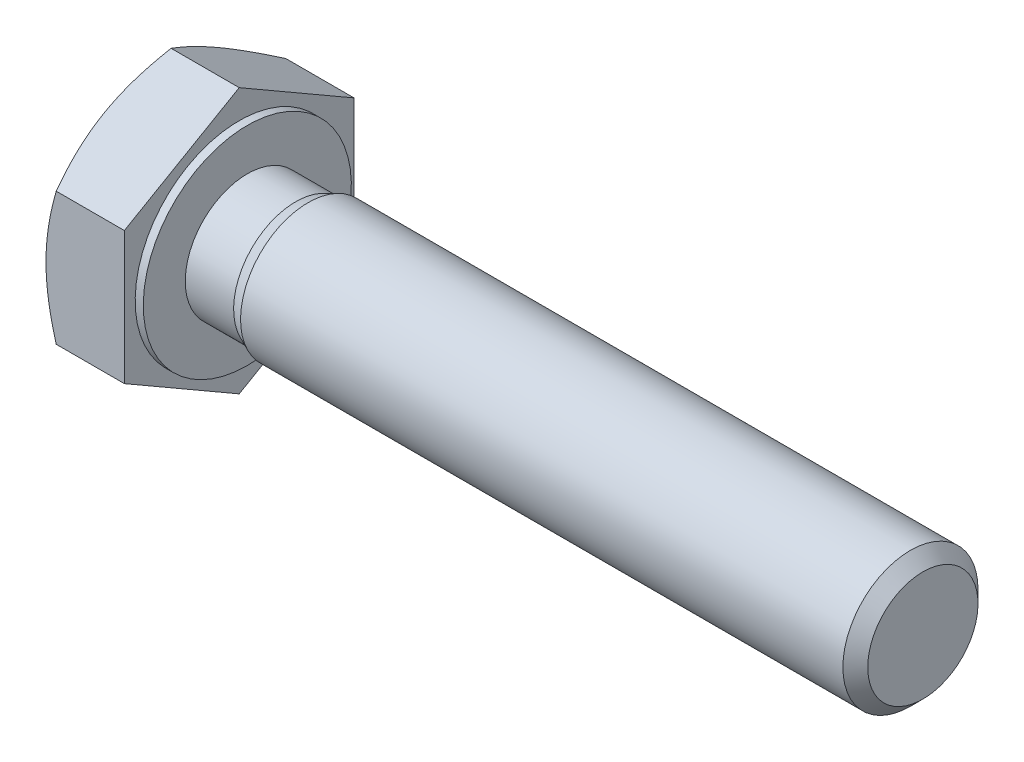
ISO-10303-21;
HEADER;
FILE_DESCRIPTION(('STEP AP214'),'2;1');
FILE_NAME('part.step','',(''),(''),'','','');
FILE_SCHEMA(('AUTOMOTIVE_DESIGN { 1 0 10303 214 1 1 1 1 }'));
ENDSEC;
DATA;
#1=APPLICATION_CONTEXT('core data for automotive mechanical design processes');
#2=APPLICATION_PROTOCOL_DEFINITION('international standard','automotive_design',2000,#1);
#3=PRODUCT_CONTEXT('',#1,'mechanical');
#4=PRODUCT('Part','Part','',(#3));
#5=PRODUCT_RELATED_PRODUCT_CATEGORY('part','',(#4));
#6=PRODUCT_DEFINITION_FORMATION('','',#4);
#7=PRODUCT_DEFINITION_CONTEXT('part definition',#1,'design');
#8=PRODUCT_DEFINITION('design','',#6,#7);
#9=PRODUCT_DEFINITION_SHAPE('','',#8);
#10=(LENGTH_UNIT() NAMED_UNIT(*) SI_UNIT(.MILLI.,.METRE.));
#11=(NAMED_UNIT(*) PLANE_ANGLE_UNIT() SI_UNIT($,.RADIAN.));
#12=(NAMED_UNIT(*) SI_UNIT($,.STERADIAN.) SOLID_ANGLE_UNIT());
#13=UNCERTAINTY_MEASURE_WITH_UNIT(LENGTH_MEASURE(1.E-05),#10,'distance_accuracy_value','');
#14=(GEOMETRIC_REPRESENTATION_CONTEXT(3) GLOBAL_UNCERTAINTY_ASSIGNED_CONTEXT((#13)) GLOBAL_UNIT_ASSIGNED_CONTEXT((#10,
#11,#12)) REPRESENTATION_CONTEXT('',''));
#15=CARTESIAN_POINT('',(0.,0.,0.));
#16=DIRECTION('',(0.,0.,1.));
#17=DIRECTION('',(1.,0.,0.));
#18=AXIS2_PLACEMENT_3D('',#15,#16,#17);
#19=CARTESIAN_POINT('',(4.03986250000001,0.,0.));
#20=DIRECTION('',(1.,0.,0.));
#21=DIRECTION('',(0.,1.,0.));
#22=AXIS2_PLACEMENT_3D('',#19,#20,#21);
#23=CONICAL_SURFACE('',#22,4.79702525,0.415442816396765);
#24=CARTESIAN_POINT('',(4.5,0.,0.));
#25=DIRECTION('',(1.,0.,0.));
#26=DIRECTION('',(0.,1.,0.));
#27=AXIS2_PLACEMENT_3D('',#24,#25,#26);
#28=CIRCLE('',#27,5.);
#29=CARTESIAN_POINT('',(4.5,-5.,0.));
#30=VERTEX_POINT('',#29);
#31=EDGE_CURVE('E188',#30,#30,#28,.T.);
#32=ORIENTED_EDGE('',*,*,#31,.F.);
#33=DIRECTION('',(-0.914937691667368,0.403595119354023,0.));
#34=VECTOR('',#33,1.);
#35=CARTESIAN_POINT('',(4.03986250000001,-4.79702525,0.));
#36=LINE('',#35,#34);
#37=CARTESIAN_POINT('',(3.579725,-4.5940505,0.));
#38=VERTEX_POINT('',#37);
#39=EDGE_CURVE('E11',#30,#38,#36,.T.);
#40=ORIENTED_EDGE('',*,*,#39,.T.);
#41=CARTESIAN_POINT('',(3.579725,0.,0.));
#42=DIRECTION('',(1.,0.,0.));
#43=DIRECTION('',(0.,1.,0.));
#44=AXIS2_PLACEMENT_3D('',#41,#42,#43);
#45=CIRCLE('',#44,4.5940505);
#46=EDGE_CURVE('E233',#38,#38,#45,.T.);
#47=ORIENTED_EDGE('',*,*,#46,.T.);
#48=ORIENTED_EDGE('',*,*,#39,.F.);
#49=EDGE_LOOP('',(#32,#40,#47,#48));
#50=FACE_BOUND('',#49,.T.);
#51=ADVANCED_FACE('F17',(#50),#23,.T.);
#52=CARTESIAN_POINT('',(1.7898625,0.,0.));
#53=DIRECTION('',(1.,0.,0.));
#54=DIRECTION('',(0.,1.,0.));
#55=AXIS2_PLACEMENT_3D('',#52,#53,#54);
#56=CYLINDRICAL_SURFACE('',#55,4.5940505);
#57=ORIENTED_EDGE('',*,*,#46,.F.);
#58=DIRECTION('',(-1.,0.,0.));
#59=VECTOR('',#58,1.);
#60=CARTESIAN_POINT('',(1.7898625,-4.5940505,0.));
#61=LINE('',#60,#59);
#62=CARTESIAN_POINT('',(0.,-4.5940505,0.));
#63=VERTEX_POINT('',#62);
#64=EDGE_CURVE('E28',#38,#63,#61,.T.);
#65=ORIENTED_EDGE('',*,*,#64,.T.);
#66=CARTESIAN_POINT('',(0.,0.,0.));
#67=DIRECTION('',(1.,0.,0.));
#68=DIRECTION('',(0.,1.,0.));
#69=AXIS2_PLACEMENT_3D('',#66,#67,#68);
#70=CIRCLE('',#69,4.5940505);
#71=EDGE_CURVE('E236',#63,#63,#70,.T.);
#72=ORIENTED_EDGE('',*,*,#71,.T.);
#73=ORIENTED_EDGE('',*,*,#64,.F.);
#74=EDGE_LOOP('',(#57,#65,#72,#73));
#75=FACE_BOUND('',#74,.T.);
#76=ADVANCED_FACE('F445',(#75),#56,.T.);
#77=CARTESIAN_POINT('',(0.,6.14702525,0.));
#78=DIRECTION('',(1.,0.,0.));
#79=DIRECTION('',(0.,1.,0.));
#80=AXIS2_PLACEMENT_3D('',#77,#78,#79);
#81=PLANE('',#80);
#82=ORIENTED_EDGE('',*,*,#71,.F.);
#83=EDGE_LOOP('',(#82));
#84=FACE_BOUND('',#83,.T.);
#85=CARTESIAN_POINT('',(0.,0.,0.));
#86=DIRECTION('',(1.,0.,0.));
#87=DIRECTION('',(0.,1.,0.));
#88=AXIS2_PLACEMENT_3D('',#85,#86,#87);
#89=CIRCLE('',#88,7.7);
#90=CARTESIAN_POINT('',(0.,-7.7,0.));
#91=VERTEX_POINT('',#90);
#92=EDGE_CURVE('E309',#91,#91,#89,.T.);
#93=ORIENTED_EDGE('',*,*,#92,.T.);
#94=EDGE_LOOP('',(#93));
#95=FACE_BOUND('',#94,.T.);
#96=ADVANCED_FACE('F450',(#84,#95),#81,.T.);
#97=CARTESIAN_POINT('',(-0.30005,0.,0.));
#98=DIRECTION('',(1.,0.,0.));
#99=DIRECTION('',(0.,1.,0.));
#100=AXIS2_PLACEMENT_3D('',#97,#98,#99);
#101=CYLINDRICAL_SURFACE('',#100,7.7);
#102=ORIENTED_EDGE('',*,*,#92,.F.);
#103=DIRECTION('',(-1.,0.,0.));
#104=VECTOR('',#103,1.);
#105=CARTESIAN_POINT('',(-0.30005,-7.7,0.));
#106=LINE('',#105,#104);
#107=CARTESIAN_POINT('',(-0.600099999999993,-7.7,0.));
#108=VERTEX_POINT('',#107);
#109=EDGE_CURVE('E316',#91,#108,#106,.T.);
#110=ORIENTED_EDGE('',*,*,#109,.T.);
#111=CARTESIAN_POINT('',(-0.600099999999992,0.,0.));
#112=DIRECTION('',(1.,0.,0.));
#113=DIRECTION('',(0.,1.,0.));
#114=AXIS2_PLACEMENT_3D('',#111,#112,#113);
#115=CIRCLE('',#114,7.7);
#116=EDGE_CURVE('E161',#108,#108,#115,.T.);
#117=ORIENTED_EDGE('',*,*,#116,.T.);
#118=ORIENTED_EDGE('',*,*,#109,.F.);
#119=EDGE_LOOP('',(#102,#110,#117,#118));
#120=FACE_BOUND('',#119,.T.);
#121=ADVANCED_FACE('F468',(#120),#101,.T.);
#122=CARTESIAN_POINT('',(-6.4001,0.,0.));
#123=DIRECTION('',(1.,0.,0.));
#124=DIRECTION('',(0.,1.,0.));
#125=AXIS2_PLACEMENT_3D('',#122,#123,#124);
#126=PLANE('',#125);
#127=CARTESIAN_POINT('',(-6.4001,0.,0.));
#128=DIRECTION('',(-1.,0.,0.));
#129=DIRECTION('',(0.,1.,0.));
#130=AXIS2_PLACEMENT_3D('',#127,#128,#129);
#131=CIRCLE('',#130,8.5);
#132=CARTESIAN_POINT('',(-6.4001,0.,8.5));
#133=VERTEX_POINT('',#132);
#134=CARTESIAN_POINT('',(-6.4001,7.36121593216772,4.25));
#135=VERTEX_POINT('',#134);
#136=EDGE_CURVE('E242',#133,#135,#131,.T.);
#137=ORIENTED_EDGE('',*,*,#136,.T.);
#138=CARTESIAN_POINT('',(-6.4001,0.,0.));
#139=DIRECTION('',(-1.,0.,0.));
#140=DIRECTION('',(0.,1.,0.));
#141=AXIS2_PLACEMENT_3D('',#138,#139,#140);
#142=CIRCLE('',#141,8.5);
#143=CARTESIAN_POINT('',(-6.4001,7.36121593216772,-4.25));
#144=VERTEX_POINT('',#143);
#145=EDGE_CURVE('E243',#135,#144,#142,.T.);
#146=ORIENTED_EDGE('',*,*,#145,.T.);
#147=CARTESIAN_POINT('',(-6.4001,0.,0.));
#148=DIRECTION('',(-1.,0.,0.));
#149=DIRECTION('',(0.,1.,0.));
#150=AXIS2_PLACEMENT_3D('',#147,#148,#149);
#151=CIRCLE('',#150,8.5);
#152=CARTESIAN_POINT('',(-6.4001,0.,-8.5));
#153=VERTEX_POINT('',#152);
#154=EDGE_CURVE('E263',#144,#153,#151,.T.);
#155=ORIENTED_EDGE('',*,*,#154,.T.);
#156=CARTESIAN_POINT('',(-6.4001,0.,0.));
#157=DIRECTION('',(-1.,0.,0.));
#158=DIRECTION('',(0.,1.,0.));
#159=AXIS2_PLACEMENT_3D('',#156,#157,#158);
#160=CIRCLE('',#159,8.5);
#161=CARTESIAN_POINT('',(-6.4001,-7.36121593216772,-4.25));
#162=VERTEX_POINT('',#161);
#163=EDGE_CURVE('E184',#153,#162,#160,.T.);
#164=ORIENTED_EDGE('',*,*,#163,.T.);
#165=CARTESIAN_POINT('',(-6.4001,0.,0.));
#166=DIRECTION('',(-1.,0.,0.));
#167=DIRECTION('',(0.,1.,0.));
#168=AXIS2_PLACEMENT_3D('',#165,#166,#167);
#169=CIRCLE('',#168,8.5);
#170=CARTESIAN_POINT('',(-6.4001,-7.36121593216773,4.25));
#171=VERTEX_POINT('',#170);
#172=EDGE_CURVE('E264',#162,#171,#169,.T.);
#173=ORIENTED_EDGE('',*,*,#172,.T.);
#174=CARTESIAN_POINT('',(-6.4001,0.,0.));
#175=DIRECTION('',(-1.,0.,0.));
#176=DIRECTION('',(0.,1.,0.));
#177=AXIS2_PLACEMENT_3D('',#174,#175,#176);
#178=CIRCLE('',#177,8.5);
#179=EDGE_CURVE('E194',#171,#133,#178,.T.);
#180=ORIENTED_EDGE('',*,*,#179,.T.);
#181=EDGE_LOOP('',(#137,#146,#155,#164,#173,#180));
#182=FACE_BOUND('',#181,.T.);
#183=ADVANCED_FACE('F372',(#182),#126,.F.);
#184=CARTESIAN_POINT('',(-0.600099999999993,-9.81495457622363,0.));
#185=DIRECTION('',(0.,-0.866025403784439,-0.5));
#186=DIRECTION('',(0.,0.5,-0.866025403784439));
#187=AXIS2_PLACEMENT_3D('',#184,#185,#186);
#188=PLANE('',#187);
#189=CARTESIAN_POINT('',(-6.4001,-7.36121593216772,-4.25));
#190=CARTESIAN_POINT('',(-6.40010000000002,-6.22243186433546,-6.22243186433545));
#191=CARTESIAN_POINT('',(-5.64091062144518,-4.90747728811183,-8.5));
#192=(BOUNDED_CURVE() B_SPLINE_CURVE(2,(#189,#190,#191),.UNSPECIFIED.,.F.,
.F.) B_SPLINE_CURVE_WITH_KNOTS((3,3),(0.497853260958953,0.995706521917906),
.UNSPECIFIED.) CURVE() GEOMETRIC_REPRESENTATION_ITEM() RATIONAL_B_SPLINE_CURVE((1.,
1.03795484930205,1.)) REPRESENTATION_ITEM(''));
#193=CARTESIAN_POINT('',(-5.64091062144518,-4.90747728811183,-8.5));
#194=VERTEX_POINT('',#193);
#195=EDGE_CURVE('E168',#162,#194,#192,.T.);
#196=ORIENTED_EDGE('',*,*,#195,.T.);
#197=DIRECTION('',(-1.,0.,0.));
#198=VECTOR('',#197,1.);
#199=CARTESIAN_POINT('',(-0.600099999999993,-4.90747728811181,-8.5));
#200=LINE('',#199,#198);
#201=CARTESIAN_POINT('',(-0.600099999999993,-4.90747728811181,-8.5));
#202=VERTEX_POINT('',#201);
#203=EDGE_CURVE('E164',#202,#194,#200,.T.);
#204=ORIENTED_EDGE('',*,*,#203,.F.);
#205=DIRECTION('',(0.,0.5,-0.866025403784439));
#206=VECTOR('',#205,1.);
#207=CARTESIAN_POINT('',(-0.600099999999993,-9.81495457622363,0.));
#208=LINE('',#207,#206);
#209=CARTESIAN_POINT('',(-0.600099999999993,-9.81495457622363,0.));
#210=VERTEX_POINT('',#209);
#211=EDGE_CURVE('E148',#210,#202,#208,.T.);
#212=ORIENTED_EDGE('',*,*,#211,.F.);
#213=DIRECTION('',(-1.,0.,0.));
#214=VECTOR('',#213,1.);
#215=CARTESIAN_POINT('',(-0.600099999999993,-9.81495457622363,0.));
#216=LINE('',#215,#214);
#217=CARTESIAN_POINT('',(-5.64091062144518,-9.81495457622362,0.));
#218=VERTEX_POINT('',#217);
#219=EDGE_CURVE('E297',#210,#218,#216,.T.);
#220=ORIENTED_EDGE('',*,*,#219,.T.);
#221=CARTESIAN_POINT('',(-5.64091062144518,-9.81495457622362,0.));
#222=CARTESIAN_POINT('',(-6.40010000000002,-8.49999999999999,-2.27756813566456));
#223=CARTESIAN_POINT('',(-6.4001,-7.36121593216772,-4.25));
#224=(BOUNDED_CURVE() B_SPLINE_CURVE(2,(#221,#222,#223),.UNSPECIFIED.,.F.,
.F.) B_SPLINE_CURVE_WITH_KNOTS((3,3),(0.,0.497853260958953),
.UNSPECIFIED.) CURVE() GEOMETRIC_REPRESENTATION_ITEM() RATIONAL_B_SPLINE_CURVE((1.,
1.03795484930206,1.)) REPRESENTATION_ITEM(''));
#225=EDGE_CURVE('E220',#218,#162,#224,.T.);
#226=ORIENTED_EDGE('',*,*,#225,.T.);
#227=EDGE_LOOP('',(#196,#204,#212,#220,#226));
#228=FACE_BOUND('',#227,.T.);
#229=ADVANCED_FACE('F165',(#228),#188,.T.);
#230=CARTESIAN_POINT('',(-0.600099999999993,-4.90747728811182,8.5));
#231=DIRECTION('',(0.,-0.866025403784439,0.5));
#232=DIRECTION('',(-1.,0.,0.));
#233=AXIS2_PLACEMENT_3D('',#230,#231,#232);
#234=PLANE('',#233);
#235=CARTESIAN_POINT('',(-6.4001,-7.36121593216773,4.25));
#236=CARTESIAN_POINT('',(-6.40010000000002,-8.5,2.27756813566455));
#237=CARTESIAN_POINT('',(-5.64091062144518,-9.81495457622362,0.));
#238=(BOUNDED_CURVE() B_SPLINE_CURVE(2,(#235,#236,#237),.UNSPECIFIED.,.F.,
.F.) B_SPLINE_CURVE_WITH_KNOTS((3,3),(0.497853260958953,0.995706521917906),
.UNSPECIFIED.) CURVE() GEOMETRIC_REPRESENTATION_ITEM() RATIONAL_B_SPLINE_CURVE((1.,
1.03795484930203,1.)) REPRESENTATION_ITEM(''));
#239=EDGE_CURVE('E225',#171,#218,#238,.T.);
#240=ORIENTED_EDGE('',*,*,#239,.T.);
#241=ORIENTED_EDGE('',*,*,#219,.F.);
#242=DIRECTION('',(0.,-0.5,-0.866025403784439));
#243=VECTOR('',#242,1.);
#244=CARTESIAN_POINT('',(-0.600099999999993,-4.90747728811182,8.5));
#245=LINE('',#244,#243);
#246=CARTESIAN_POINT('',(-0.600099999999993,-4.90747728811182,8.5));
#247=VERTEX_POINT('',#246);
#248=EDGE_CURVE('E158',#247,#210,#245,.T.);
#249=ORIENTED_EDGE('',*,*,#248,.F.);
#250=DIRECTION('',(-1.,0.,0.));
#251=VECTOR('',#250,1.);
#252=CARTESIAN_POINT('',(-0.600099999999993,-4.90747728811182,8.5));
#253=LINE('',#252,#251);
#254=CARTESIAN_POINT('',(-5.64091062144518,-4.90747728811179,8.5));
#255=VERTEX_POINT('',#254);
#256=EDGE_CURVE('E212',#247,#255,#253,.T.);
#257=ORIENTED_EDGE('',*,*,#256,.T.);
#258=CARTESIAN_POINT('',(-5.64091062144518,-4.90747728811184,8.5));
#259=CARTESIAN_POINT('',(-6.40010000000002,-6.22243186433548,6.22243186433543));
#260=CARTESIAN_POINT('',(-6.4001,-7.36121593216773,4.25));
#261=(BOUNDED_CURVE() B_SPLINE_CURVE(2,(#258,#259,#260),.UNSPECIFIED.,.F.,
.F.) B_SPLINE_CURVE_WITH_KNOTS((3,3),(0.,0.497853260958953),
.UNSPECIFIED.) CURVE() GEOMETRIC_REPRESENTATION_ITEM() RATIONAL_B_SPLINE_CURVE((1.,
1.03795484930204,1.)) REPRESENTATION_ITEM(''));
#262=EDGE_CURVE('E199',#255,#171,#261,.T.);
#263=ORIENTED_EDGE('',*,*,#262,.T.);
#264=EDGE_LOOP('',(#240,#241,#249,#257,#263));
#265=FACE_BOUND('',#264,.T.);
#266=ADVANCED_FACE('F364',(#265),#234,.T.);
#267=CARTESIAN_POINT('',(-0.6001,4.90747728811181,8.5));
#268=DIRECTION('',(0.,0.,1.));
#269=DIRECTION('',(0.,-1.,0.));
#270=AXIS2_PLACEMENT_3D('',#267,#268,#269);
#271=PLANE('',#270);
#272=CARTESIAN_POINT('',(-6.4001,0.,8.5));
#273=CARTESIAN_POINT('',(-6.40010000000002,-2.27756813566454,8.49999999999999));
#274=CARTESIAN_POINT('',(-5.64091062144518,-4.90747728811179,8.5));
#275=(BOUNDED_CURVE() B_SPLINE_CURVE(2,(#272,#273,#274),.UNSPECIFIED.,.F.,
.F.) B_SPLINE_CURVE_WITH_KNOTS((3,3),(0.497853260958953,0.995706521917907),
.UNSPECIFIED.) CURVE() GEOMETRIC_REPRESENTATION_ITEM() RATIONAL_B_SPLINE_CURVE((1.,
1.03795484930206,1.)) REPRESENTATION_ITEM(''));
#276=EDGE_CURVE('E198',#133,#255,#275,.T.);
#277=ORIENTED_EDGE('',*,*,#276,.T.);
#278=ORIENTED_EDGE('',*,*,#256,.F.);
#279=DIRECTION('',(0.,-1.,0.));
#280=VECTOR('',#279,1.);
#281=CARTESIAN_POINT('',(-0.6001,4.90747728811181,8.5));
#282=LINE('',#281,#280);
#283=CARTESIAN_POINT('',(-0.6001,4.90747728811181,8.5));
#284=VERTEX_POINT('',#283);
#285=EDGE_CURVE('E232',#284,#247,#282,.T.);
#286=ORIENTED_EDGE('',*,*,#285,.F.);
#287=DIRECTION('',(-1.,0.,0.));
#288=VECTOR('',#287,1.);
#289=CARTESIAN_POINT('',(-0.6001,4.90747728811181,8.5));
#290=LINE('',#289,#288);
#291=CARTESIAN_POINT('',(-5.64091062144518,4.90747728811178,8.5));
#292=VERTEX_POINT('',#291);
#293=EDGE_CURVE('E189',#284,#292,#290,.T.);
#294=ORIENTED_EDGE('',*,*,#293,.T.);
#295=CARTESIAN_POINT('',(-5.64091062144518,4.90747728811178,8.5));
#296=CARTESIAN_POINT('',(-6.40010000000002,2.27756813566453,8.5));
#297=CARTESIAN_POINT('',(-6.4001,0.,8.5));
#298=(BOUNDED_CURVE() B_SPLINE_CURVE(2,(#295,#296,#297),.UNSPECIFIED.,.F.,
.F.) B_SPLINE_CURVE_WITH_KNOTS((3,3),(0.,0.497853260958953),
.UNSPECIFIED.) CURVE() GEOMETRIC_REPRESENTATION_ITEM() RATIONAL_B_SPLINE_CURVE((1.,
1.03795484930206,1.)) REPRESENTATION_ITEM(''));
#299=EDGE_CURVE('E205',#292,#133,#298,.T.);
#300=ORIENTED_EDGE('',*,*,#299,.T.);
#301=EDGE_LOOP('',(#277,#278,#286,#294,#300));
#302=FACE_BOUND('',#301,.T.);
#303=ADVANCED_FACE('F359',(#302),#271,.T.);
#304=CARTESIAN_POINT('',(-0.6001,0.,0.));
#305=DIRECTION('',(1.,0.,0.));
#306=DIRECTION('',(0.,1.,0.));
#307=AXIS2_PLACEMENT_3D('',#304,#305,#306);
#308=PLANE('',#307);
#309=ORIENTED_EDGE('',*,*,#116,.F.);
#310=EDGE_LOOP('',(#309));
#311=FACE_BOUND('',#310,.T.);
#312=DIRECTION('',(0.,-0.5,0.866025403784438));
#313=VECTOR('',#312,1.);
#314=CARTESIAN_POINT('',(-0.6001,9.81495457622363,0.));
#315=LINE('',#314,#313);
#316=CARTESIAN_POINT('',(-0.6001,9.81495457622363,0.));
#317=VERTEX_POINT('',#316);
#318=EDGE_CURVE('E193',#317,#284,#315,.T.);
#319=ORIENTED_EDGE('',*,*,#318,.T.);
#320=ORIENTED_EDGE('',*,*,#285,.T.);
#321=ORIENTED_EDGE('',*,*,#248,.T.);
#322=ORIENTED_EDGE('',*,*,#211,.T.);
#323=DIRECTION('',(0.,1.,0.));
#324=VECTOR('',#323,1.);
#325=CARTESIAN_POINT('',(-0.600099999999993,-4.90747728811181,-8.5));
#326=LINE('',#325,#324);
#327=CARTESIAN_POINT('',(-0.6001,4.90747728811182,-8.5));
#328=VERTEX_POINT('',#327);
#329=EDGE_CURVE('E154',#202,#328,#326,.T.);
#330=ORIENTED_EDGE('',*,*,#329,.T.);
#331=DIRECTION('',(0.,0.5,0.866025403784439));
#332=VECTOR('',#331,1.);
#333=CARTESIAN_POINT('',(-0.6001,4.90747728811182,-8.5));
#334=LINE('',#333,#332);
#335=EDGE_CURVE('E21',#328,#317,#334,.T.);
#336=ORIENTED_EDGE('',*,*,#335,.T.);
#337=EDGE_LOOP('',(#319,#320,#321,#322,#330,#336));
#338=FACE_BOUND('',#337,.T.);
#339=ADVANCED_FACE('F151',(#311,#338),#308,.T.);
#340=CARTESIAN_POINT('',(-0.6001,9.81495457622363,0.));
#341=DIRECTION('',(0.,0.866025403784438,0.5));
#342=DIRECTION('',(1.,0.,0.));
#343=AXIS2_PLACEMENT_3D('',#340,#341,#342);
#344=PLANE('',#343);
#345=CARTESIAN_POINT('',(-5.64091062144518,9.81495457622362,0.));
#346=CARTESIAN_POINT('',(-6.40010000000001,8.5,2.27756813566456));
#347=CARTESIAN_POINT('',(-6.4001,7.36121593216772,4.25));
#348=(BOUNDED_CURVE() B_SPLINE_CURVE(2,(#345,#346,#347),.UNSPECIFIED.,.F.,
.F.) B_SPLINE_CURVE_WITH_KNOTS((3,3),(0.,0.497853260958953),
.UNSPECIFIED.) CURVE() GEOMETRIC_REPRESENTATION_ITEM() RATIONAL_B_SPLINE_CURVE((1.,
1.03795484930205,1.)) REPRESENTATION_ITEM(''));
#349=CARTESIAN_POINT('',(-5.64091062144518,9.81495457622362,0.));
#350=VERTEX_POINT('',#349);
#351=EDGE_CURVE('E226',#350,#135,#348,.T.);
#352=ORIENTED_EDGE('',*,*,#351,.T.);
#353=CARTESIAN_POINT('',(-6.4001,7.36121593216772,4.25));
#354=CARTESIAN_POINT('',(-6.40010000000002,6.22243186433546,6.22243186433544));
#355=CARTESIAN_POINT('',(-5.64091062144518,4.90747728811182,8.5));
#356=(BOUNDED_CURVE() B_SPLINE_CURVE(2,(#353,#354,#355),.UNSPECIFIED.,.F.,
.F.) B_SPLINE_CURVE_WITH_KNOTS((3,3),(0.497853260958953,0.995706521917907),
.UNSPECIFIED.) CURVE() GEOMETRIC_REPRESENTATION_ITEM() RATIONAL_B_SPLINE_CURVE((1.,
1.03795484930206,1.)) REPRESENTATION_ITEM(''));
#357=EDGE_CURVE('E298',#135,#292,#356,.T.);
#358=ORIENTED_EDGE('',*,*,#357,.T.);
#359=ORIENTED_EDGE('',*,*,#293,.F.);
#360=ORIENTED_EDGE('',*,*,#318,.F.);
#361=DIRECTION('',(-1.,0.,0.));
#362=VECTOR('',#361,1.);
#363=CARTESIAN_POINT('',(-0.6001,9.81495457622363,0.));
#364=LINE('',#363,#362);
#365=EDGE_CURVE('E173',#317,#350,#364,.T.);
#366=ORIENTED_EDGE('',*,*,#365,.T.);
#367=EDGE_LOOP('',(#352,#358,#359,#360,#366));
#368=FACE_BOUND('',#367,.T.);
#369=ADVANCED_FACE('F462',(#368),#344,.T.);
#370=CARTESIAN_POINT('',(-0.6001,4.90747728811182,-8.5));
#371=DIRECTION('',(0.,0.866025403784439,-0.5));
#372=DIRECTION('',(-1.,0.,0.));
#373=AXIS2_PLACEMENT_3D('',#370,#371,#372);
#374=PLANE('',#373);
#375=CARTESIAN_POINT('',(-5.64091062144518,4.90747728811183,-8.5));
#376=CARTESIAN_POINT('',(-6.40010000000002,6.22243186433545,-6.22243186433545));
#377=CARTESIAN_POINT('',(-6.4001,7.36121593216772,-4.25));
#378=(BOUNDED_CURVE() B_SPLINE_CURVE(2,(#375,#376,#377),.UNSPECIFIED.,.F.,
.F.) B_SPLINE_CURVE_WITH_KNOTS((3,3),(0.,0.497853260958954),
.UNSPECIFIED.) CURVE() GEOMETRIC_REPRESENTATION_ITEM() RATIONAL_B_SPLINE_CURVE((1.,
1.03795484930204,1.)) REPRESENTATION_ITEM(''));
#379=CARTESIAN_POINT('',(-5.64091062144518,4.90747728811179,-8.5));
#380=VERTEX_POINT('',#379);
#381=EDGE_CURVE('E265',#380,#144,#378,.T.);
#382=ORIENTED_EDGE('',*,*,#381,.T.);
#383=CARTESIAN_POINT('',(-6.4001,7.36121593216772,-4.25));
#384=CARTESIAN_POINT('',(-6.40010000000002,8.49999999999999,-2.27756813566454));
#385=CARTESIAN_POINT('',(-5.64091062144518,9.81495457622362,0.));
#386=(BOUNDED_CURVE() B_SPLINE_CURVE(2,(#383,#384,#385),.UNSPECIFIED.,.F.,
.F.) B_SPLINE_CURVE_WITH_KNOTS((3,3),(0.497853260958954,0.995706521917908),
.UNSPECIFIED.) CURVE() GEOMETRIC_REPRESENTATION_ITEM() RATIONAL_B_SPLINE_CURVE((1.,
1.03795484930204,1.)) REPRESENTATION_ITEM(''));
#387=EDGE_CURVE('E197',#144,#350,#386,.T.);
#388=ORIENTED_EDGE('',*,*,#387,.T.);
#389=ORIENTED_EDGE('',*,*,#365,.F.);
#390=ORIENTED_EDGE('',*,*,#335,.F.);
#391=DIRECTION('',(-1.,0.,0.));
#392=VECTOR('',#391,1.);
#393=CARTESIAN_POINT('',(-0.6001,4.90747728811182,-8.5));
#394=LINE('',#393,#392);
#395=EDGE_CURVE('E177',#328,#380,#394,.T.);
#396=ORIENTED_EDGE('',*,*,#395,.T.);
#397=EDGE_LOOP('',(#382,#388,#389,#390,#396));
#398=FACE_BOUND('',#397,.T.);
#399=ADVANCED_FACE('F457',(#398),#374,.T.);
#400=CARTESIAN_POINT('',(-0.600099999999993,-4.90747728811181,-8.5));
#401=DIRECTION('',(0.,0.,-1.));
#402=DIRECTION('',(-1.,0.,0.));
#403=AXIS2_PLACEMENT_3D('',#400,#401,#402);
#404=PLANE('',#403);
#405=CARTESIAN_POINT('',(-5.64091062144518,-4.90747728811178,-8.5));
#406=CARTESIAN_POINT('',(-6.40010000000001,-2.27756813566453,-8.5));
#407=CARTESIAN_POINT('',(-6.4001,0.,-8.5));
#408=(BOUNDED_CURVE() B_SPLINE_CURVE(2,(#405,#406,#407),.UNSPECIFIED.,.F.,
.F.) B_SPLINE_CURVE_WITH_KNOTS((3,3),(0.,0.497853260958953),
.UNSPECIFIED.) CURVE() GEOMETRIC_REPRESENTATION_ITEM() RATIONAL_B_SPLINE_CURVE((1.,
1.03795484930204,1.)) REPRESENTATION_ITEM(''));
#409=EDGE_CURVE('E254',#194,#153,#408,.T.);
#410=ORIENTED_EDGE('',*,*,#409,.T.);
#411=CARTESIAN_POINT('',(-6.4001,0.,-8.5));
#412=CARTESIAN_POINT('',(-6.40010000000001,2.27756813566454,-8.5));
#413=CARTESIAN_POINT('',(-5.64091062144518,4.90747728811179,-8.5));
#414=(BOUNDED_CURVE() B_SPLINE_CURVE(2,(#411,#412,#413),.UNSPECIFIED.,.F.,
.F.) B_SPLINE_CURVE_WITH_KNOTS((3,3),(0.497853260958953,0.995706521917907),
.UNSPECIFIED.) CURVE() GEOMETRIC_REPRESENTATION_ITEM() RATIONAL_B_SPLINE_CURVE((1.,
1.03795484930205,1.)) REPRESENTATION_ITEM(''));
#415=EDGE_CURVE('E255',#153,#380,#414,.T.);
#416=ORIENTED_EDGE('',*,*,#415,.T.);
#417=ORIENTED_EDGE('',*,*,#395,.F.);
#418=ORIENTED_EDGE('',*,*,#329,.F.);
#419=ORIENTED_EDGE('',*,*,#203,.T.);
#420=EDGE_LOOP('',(#410,#416,#417,#418,#419));
#421=FACE_BOUND('',#420,.T.);
#422=ADVANCED_FACE('F175',(#421),#404,.T.);
#423=CARTESIAN_POINT('',(-6.02050531072259,0.,0.));
#424=DIRECTION('',(1.,0.,0.));
#425=DIRECTION('',(0.,1.,0.));
#426=AXIS2_PLACEMENT_3D('',#423,#424,#425);
#427=CONICAL_SURFACE('',#426,9.15747728811181,1.0471975511966);
#428=ORIENTED_EDGE('',*,*,#409,.F.);
#429=ORIENTED_EDGE('',*,*,#195,.F.);
#430=ORIENTED_EDGE('',*,*,#163,.F.);
#431=EDGE_LOOP('',(#428,#429,#430));
#432=FACE_BOUND('',#431,.T.);
#433=ADVANCED_FACE('F400',(#432),#427,.T.);
#434=CARTESIAN_POINT('',(-6.02050531072259,0.,0.));
#435=DIRECTION('',(1.,0.,0.));
#436=DIRECTION('',(0.,1.,0.));
#437=AXIS2_PLACEMENT_3D('',#434,#435,#436);
#438=CONICAL_SURFACE('',#437,9.15747728811181,1.0471975511966);
#439=ORIENTED_EDGE('',*,*,#415,.F.);
#440=ORIENTED_EDGE('',*,*,#154,.F.);
#441=ORIENTED_EDGE('',*,*,#381,.F.);
#442=EDGE_LOOP('',(#439,#440,#441));
#443=FACE_BOUND('',#442,.T.);
#444=ADVANCED_FACE('F405',(#443),#438,.T.);
#445=CARTESIAN_POINT('',(-6.02050531072259,0.,0.));
#446=DIRECTION('',(1.,0.,0.));
#447=DIRECTION('',(0.,-1.,0.));
#448=AXIS2_PLACEMENT_3D('',#445,#446,#447);
#449=CONICAL_SURFACE('',#448,9.15747728811181,1.0471975511966);
#450=ORIENTED_EDGE('',*,*,#225,.F.);
#451=ORIENTED_EDGE('',*,*,#239,.F.);
#452=ORIENTED_EDGE('',*,*,#172,.F.);
#453=EDGE_LOOP('',(#450,#451,#452));
#454=FACE_BOUND('',#453,.T.);
#455=ADVANCED_FACE('F369',(#454),#449,.T.);
#456=CARTESIAN_POINT('',(-6.02050531072259,0.,0.));
#457=DIRECTION('',(1.,0.,0.));
#458=DIRECTION('',(0.,1.,0.));
#459=AXIS2_PLACEMENT_3D('',#456,#457,#458);
#460=CONICAL_SURFACE('',#459,9.15747728811181,1.0471975511966);
#461=ORIENTED_EDGE('',*,*,#387,.F.);
#462=ORIENTED_EDGE('',*,*,#145,.F.);
#463=ORIENTED_EDGE('',*,*,#351,.F.);
#464=EDGE_LOOP('',(#461,#462,#463));
#465=FACE_BOUND('',#464,.T.);
#466=ADVANCED_FACE('F419',(#465),#460,.T.);
#467=CARTESIAN_POINT('',(-6.02050531072259,0.,0.));
#468=DIRECTION('',(1.,0.,0.));
#469=DIRECTION('',(0.,1.,0.));
#470=AXIS2_PLACEMENT_3D('',#467,#468,#469);
#471=CONICAL_SURFACE('',#470,9.15747728811181,1.0471975511966);
#472=ORIENTED_EDGE('',*,*,#262,.F.);
#473=ORIENTED_EDGE('',*,*,#276,.F.);
#474=ORIENTED_EDGE('',*,*,#179,.F.);
#475=EDGE_LOOP('',(#472,#473,#474));
#476=FACE_BOUND('',#475,.T.);
#477=ADVANCED_FACE('F424',(#476),#471,.T.);
#478=CARTESIAN_POINT('',(-6.02050531072259,0.,0.));
#479=DIRECTION('',(1.,0.,0.));
#480=DIRECTION('',(0.,1.,0.));
#481=AXIS2_PLACEMENT_3D('',#478,#479,#480);
#482=CONICAL_SURFACE('',#481,9.15747728811181,1.0471975511966);
#483=ORIENTED_EDGE('',*,*,#357,.F.);
#484=ORIENTED_EDGE('',*,*,#136,.F.);
#485=ORIENTED_EDGE('',*,*,#299,.F.);
#486=EDGE_LOOP('',(#483,#484,#485));
#487=FACE_BOUND('',#486,.T.);
#488=ADVANCED_FACE('F386',(#487),#482,.T.);
#489=CARTESIAN_POINT('',(50.,2.5,0.));
#490=DIRECTION('',(1.,0.,0.));
#491=DIRECTION('',(0.,1.,0.));
#492=AXIS2_PLACEMENT_3D('',#489,#490,#491);
#493=PLANE('',#492);
#494=CARTESIAN_POINT('',(50.,0.,0.));
#495=DIRECTION('',(-1.,0.,0.));
#496=DIRECTION('',(0.,-1.,0.));
#497=AXIS2_PLACEMENT_3D('',#494,#495,#496);
#498=CIRCLE('',#497,4.079825);
#499=CARTESIAN_POINT('',(50.,4.079825,0.));
#500=VERTEX_POINT('',#499);
#501=EDGE_CURVE('E213',#500,#500,#498,.T.);
#502=ORIENTED_EDGE('',*,*,#501,.F.);
#503=EDGE_LOOP('',(#502));
#504=FACE_BOUND('',#503,.T.);
#505=ADVANCED_FACE('F19',(#504),#493,.T.);
#506=CARTESIAN_POINT('',(27.25,0.,0.));
#507=DIRECTION('',(1.,0.,0.));
#508=DIRECTION('',(0.,1.,0.));
#509=AXIS2_PLACEMENT_3D('',#506,#507,#508);
#510=CYLINDRICAL_SURFACE('',#509,5.);
#511=CARTESIAN_POINT('',(49.079725,0.,0.));
#512=DIRECTION('',(1.,0.,0.));
#513=DIRECTION('',(0.,-1.,0.));
#514=AXIS2_PLACEMENT_3D('',#511,#512,#513);
#515=CIRCLE('',#514,5.);
#516=CARTESIAN_POINT('',(49.079725,5.,0.));
#517=VERTEX_POINT('',#516);
#518=CARTESIAN_POINT('',(49.079725,-5.,0.));
#519=VERTEX_POINT('',#518);
#520=EDGE_CURVE('E277',#517,#519,#515,.T.);
#521=ORIENTED_EDGE('',*,*,#520,.F.);
#522=CARTESIAN_POINT('',(49.079725,0.,0.));
#523=DIRECTION('',(1.,0.,0.));
#524=DIRECTION('',(0.,-1.,0.));
#525=AXIS2_PLACEMENT_3D('',#522,#523,#524);
#526=CIRCLE('',#525,5.);
#527=EDGE_CURVE('E88',#519,#517,#526,.T.);
#528=ORIENTED_EDGE('',*,*,#527,.F.);
#529=DIRECTION('',(-1.,0.,0.));
#530=VECTOR('',#529,1.);
#531=CARTESIAN_POINT('',(27.25,-5.,0.));
#532=LINE('',#531,#530);
#533=EDGE_CURVE('E76',#519,#30,#532,.T.);
#534=ORIENTED_EDGE('',*,*,#533,.T.);
#535=ORIENTED_EDGE('',*,*,#31,.T.);
#536=ORIENTED_EDGE('',*,*,#533,.F.);
#537=EDGE_LOOP('',(#521,#528,#534,#535,#536));
#538=FACE_BOUND('',#537,.T.);
#539=ADVANCED_FACE('F385',(#538),#510,.T.);
#540=CARTESIAN_POINT('',(49.5398625,0.,0.));
#541=DIRECTION('',(-1.,0.,0.));
#542=DIRECTION('',(0.,-1.,0.));
#543=AXIS2_PLACEMENT_3D('',#540,#541,#542);
#544=CONICAL_SURFACE('',#543,4.5399125,0.785343828859751);
#545=ORIENTED_EDGE('',*,*,#501,.T.);
#546=DIRECTION('',(-0.707145200462813,0.707068359822732,0.));
#547=VECTOR('',#546,1.);
#548=CARTESIAN_POINT('',(49.5398625,4.53991250000001,0.));
#549=LINE('',#548,#547);
#550=EDGE_CURVE('E217',#500,#517,#549,.T.);
#551=ORIENTED_EDGE('',*,*,#550,.T.);
#552=ORIENTED_EDGE('',*,*,#520,.T.);
#553=ORIENTED_EDGE('',*,*,#527,.T.);
#554=ORIENTED_EDGE('',*,*,#550,.F.);
#555=EDGE_LOOP('',(#545,#551,#552,#553,#554));
#556=FACE_BOUND('',#555,.T.);
#557=ADVANCED_FACE('F434',(#556),#544,.T.);
#558=CLOSED_SHELL('',(#51,#76,#96,#121,#183,#229,#266,#303,#339,#369,#399,#422,#433,#444,#455,
#466,#477,#488,#505,#539,#557));
#559=MANIFOLD_SOLID_BREP('B1',#558);
#560=ADVANCED_BREP_SHAPE_REPRESENTATION('',(#18,#559),#14);
#561=SHAPE_DEFINITION_REPRESENTATION(#9,#560);
ENDSEC;
END-ISO-10303-21;
